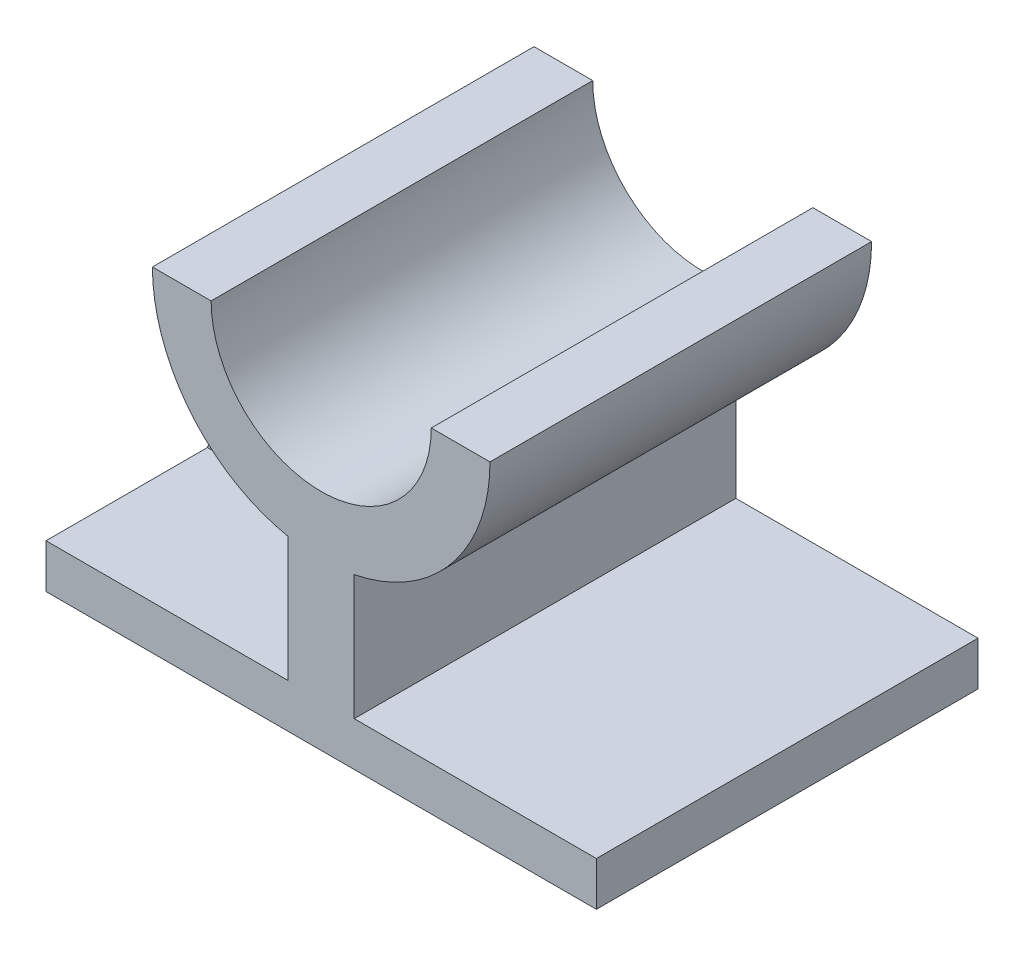
ISO-10303-21;
HEADER;
FILE_DESCRIPTION(('STEP AP214'),'2;1');
FILE_NAME('part.step','',(''),(''),'','','');
FILE_SCHEMA(('AUTOMOTIVE_DESIGN { 1 0 10303 214 1 1 1 1 }'));
ENDSEC;
DATA;
#1=APPLICATION_CONTEXT('core data for automotive mechanical design processes');
#2=APPLICATION_PROTOCOL_DEFINITION('international standard','automotive_design',2000,#1);
#3=PRODUCT_CONTEXT('',#1,'mechanical');
#4=PRODUCT('Part','Part','',(#3));
#5=PRODUCT_RELATED_PRODUCT_CATEGORY('part','',(#4));
#6=PRODUCT_DEFINITION_FORMATION('','',#4);
#7=PRODUCT_DEFINITION_CONTEXT('part definition',#1,'design');
#8=PRODUCT_DEFINITION('design','',#6,#7);
#9=PRODUCT_DEFINITION_SHAPE('','',#8);
#10=(LENGTH_UNIT() NAMED_UNIT(*) SI_UNIT(.MILLI.,.METRE.));
#11=(NAMED_UNIT(*) PLANE_ANGLE_UNIT() SI_UNIT($,.RADIAN.));
#12=(NAMED_UNIT(*) SI_UNIT($,.STERADIAN.) SOLID_ANGLE_UNIT());
#13=UNCERTAINTY_MEASURE_WITH_UNIT(LENGTH_MEASURE(1.E-05),#10,'distance_accuracy_value','');
#14=(GEOMETRIC_REPRESENTATION_CONTEXT(3) GLOBAL_UNCERTAINTY_ASSIGNED_CONTEXT((#13)) GLOBAL_UNIT_ASSIGNED_CONTEXT((#10,
#11,#12)) REPRESENTATION_CONTEXT('',''));
#15=CARTESIAN_POINT('',(0.,0.,0.));
#16=DIRECTION('',(0.,0.,1.));
#17=DIRECTION('',(1.,0.,0.));
#18=AXIS2_PLACEMENT_3D('',#15,#16,#17);
#19=CARTESIAN_POINT('',(-63.1349834925848,60.,-520.));
#20=DIRECTION('',(0.,1.,0.));
#21=DIRECTION('',(0.,0.,1.));
#22=AXIS2_PLACEMENT_3D('',#19,#20,#21);
#23=PLANE('',#22);
#24=DIRECTION('',(0.,0.,1.));
#25=VECTOR('',#24,1.);
#26=CARTESIAN_POINT('',(266.865016507415,60.,-520.));
#27=LINE('',#26,#25);
#28=CARTESIAN_POINT('',(266.865016507415,60.,-220.));
#29=VERTEX_POINT('',#28);
#30=CARTESIAN_POINT('',(266.865016507415,60.,0.));
#31=VERTEX_POINT('',#30);
#32=EDGE_CURVE('E154',#29,#31,#27,.T.);
#33=ORIENTED_EDGE('',*,*,#32,.F.);
#34=DIRECTION('',(-1.,0.,0.));
#35=VECTOR('',#34,1.);
#36=CARTESIAN_POINT('',(-63.1349834925848,60.,-220.));
#37=LINE('',#36,#35);
#38=CARTESIAN_POINT('',(-63.1349834925848,60.,-220.));
#39=VERTEX_POINT('',#38);
#40=EDGE_CURVE('E240',#29,#39,#37,.T.);
#41=ORIENTED_EDGE('',*,*,#40,.T.);
#42=DIRECTION('',(0.,0.,1.));
#43=VECTOR('',#42,1.);
#44=CARTESIAN_POINT('',(-63.1349834925848,60.,-520.));
#45=LINE('',#44,#43);
#46=CARTESIAN_POINT('',(-63.1349834925848,60.,0.));
#47=VERTEX_POINT('',#46);
#48=EDGE_CURVE('E42',#39,#47,#45,.T.);
#49=ORIENTED_EDGE('',*,*,#48,.T.);
#50=DIRECTION('',(-1.,0.,0.));
#51=VECTOR('',#50,1.);
#52=CARTESIAN_POINT('',(-63.1349834925848,60.,0.));
#53=LINE('',#52,#51);
#54=EDGE_CURVE('E210',#31,#47,#53,.T.);
#55=ORIENTED_EDGE('',*,*,#54,.F.);
#56=EDGE_LOOP('',(#33,#41,#49,#55));
#57=FACE_BOUND('',#56,.T.);
#58=ADVANCED_FACE('F33',(#57),#23,.T.);
#59=CARTESIAN_POINT('',(266.865016507415,60.,-520.));
#60=DIRECTION('',(-1.,0.,0.));
#61=DIRECTION('',(0.,0.,1.));
#62=AXIS2_PLACEMENT_3D('',#59,#60,#61);
#63=PLANE('',#62);
#64=DIRECTION('',(0.,0.,1.));
#65=VECTOR('',#64,1.);
#66=CARTESIAN_POINT('',(266.865016507415,230.,-520.));
#67=LINE('',#66,#65);
#68=CARTESIAN_POINT('',(266.865016507415,230.,-220.));
#69=VERTEX_POINT('',#68);
#70=CARTESIAN_POINT('',(266.865016507415,230.,0.));
#71=VERTEX_POINT('',#70);
#72=EDGE_CURVE('E155',#69,#71,#67,.T.);
#73=ORIENTED_EDGE('',*,*,#72,.F.);
#74=DIRECTION('',(0.,-1.,0.));
#75=VECTOR('',#74,1.);
#76=CARTESIAN_POINT('',(266.865016507415,60.,-220.));
#77=LINE('',#76,#75);
#78=EDGE_CURVE('E249',#69,#29,#77,.T.);
#79=ORIENTED_EDGE('',*,*,#78,.T.);
#80=ORIENTED_EDGE('',*,*,#32,.T.);
#81=DIRECTION('',(0.,-1.,0.));
#82=VECTOR('',#81,1.);
#83=CARTESIAN_POINT('',(266.865016507415,60.,0.));
#84=LINE('',#83,#82);
#85=EDGE_CURVE('E207',#71,#31,#84,.T.);
#86=ORIENTED_EDGE('',*,*,#85,.F.);
#87=EDGE_LOOP('',(#73,#79,#80,#86));
#88=FACE_BOUND('',#87,.T.);
#89=ADVANCED_FACE('F247',(#88),#63,.T.);
#90=CARTESIAN_POINT('',(311.865016507415,455.554871372799,-520.));
#91=DIRECTION('',(0.,0.,1.));
#92=DIRECTION('',(1.,0.,0.));
#93=AXIS2_PLACEMENT_3D('',#90,#91,#92);
#94=CYLINDRICAL_SURFACE('',#93,230.);
#95=DIRECTION('',(0.,0.,1.));
#96=VECTOR('',#95,1.);
#97=CARTESIAN_POINT('',(81.8650165074152,455.554871372799,-520.));
#98=LINE('',#97,#96);
#99=CARTESIAN_POINT('',(81.8650165074152,455.554871372799,-220.));
#100=VERTEX_POINT('',#99);
#101=CARTESIAN_POINT('',(81.8650165074152,455.554871372799,0.));
#102=VERTEX_POINT('',#101);
#103=EDGE_CURVE('E218',#100,#102,#98,.T.);
#104=ORIENTED_EDGE('',*,*,#103,.F.);
#105=CARTESIAN_POINT('',(311.865016507415,455.554871372799,-220.));
#106=DIRECTION('',(0.,0.,-1.));
#107=DIRECTION('',(-1.,0.,0.));
#108=AXIS2_PLACEMENT_3D('',#105,#106,#107);
#109=CIRCLE('',#108,230.);
#110=EDGE_CURVE('E252',#100,#69,#109,.F.);
#111=ORIENTED_EDGE('',*,*,#110,.T.);
#112=ORIENTED_EDGE('',*,*,#72,.T.);
#113=CARTESIAN_POINT('',(311.865016507415,455.554871372799,0.));
#114=DIRECTION('',(0.,0.,1.));
#115=DIRECTION('',(1.,0.,0.));
#116=AXIS2_PLACEMENT_3D('',#113,#114,#115);
#117=CIRCLE('',#116,230.);
#118=EDGE_CURVE('E204',#102,#71,#117,.T.);
#119=ORIENTED_EDGE('',*,*,#118,.F.);
#120=EDGE_LOOP('',(#104,#111,#112,#119));
#121=FACE_BOUND('',#120,.T.);
#122=ADVANCED_FACE('F315',(#121),#94,.T.);
#123=CARTESIAN_POINT('',(-63.1349834925848,0.,-520.));
#124=DIRECTION('',(-1.,0.,0.));
#125=DIRECTION('',(0.,0.,1.));
#126=AXIS2_PLACEMENT_3D('',#123,#124,#125);
#127=PLANE('',#126);
#128=DIRECTION('',(0.,0.,1.));
#129=VECTOR('',#128,1.);
#130=CARTESIAN_POINT('',(-63.1349834925848,0.,-520.));
#131=LINE('',#130,#129);
#132=CARTESIAN_POINT('',(-63.1349834925848,0.,-520.));
#133=VERTEX_POINT('',#132);
#134=CARTESIAN_POINT('',(-63.1349834925848,0.,0.));
#135=VERTEX_POINT('',#134);
#136=EDGE_CURVE('E37',#133,#135,#131,.T.);
#137=ORIENTED_EDGE('',*,*,#136,.T.);
#138=DIRECTION('',(0.,-1.,0.));
#139=VECTOR('',#138,1.);
#140=CARTESIAN_POINT('',(-63.1349834925848,0.,0.));
#141=LINE('',#140,#139);
#142=EDGE_CURVE('E176',#47,#135,#141,.T.);
#143=ORIENTED_EDGE('',*,*,#142,.F.);
#144=ORIENTED_EDGE('',*,*,#48,.F.);
#145=DIRECTION('',(0.,0.,-1.));
#146=VECTOR('',#145,1.);
#147=CARTESIAN_POINT('',(-63.1349834925848,60.,-520.));
#148=LINE('',#147,#146);
#149=CARTESIAN_POINT('',(-63.1349834925848,60.,-300.));
#150=VERTEX_POINT('',#149);
#151=EDGE_CURVE('E180',#150,#39,#148,.F.);
#152=ORIENTED_EDGE('',*,*,#151,.F.);
#153=CARTESIAN_POINT('',(-63.1349834925848,60.,-520.));
#154=VERTEX_POINT('',#153);
#155=EDGE_CURVE('E11',#154,#150,#45,.T.);
#156=ORIENTED_EDGE('',*,*,#155,.F.);
#157=DIRECTION('',(0.,-1.,0.));
#158=VECTOR('',#157,1.);
#159=CARTESIAN_POINT('',(-63.1349834925848,0.,-520.));
#160=LINE('',#159,#158);
#161=EDGE_CURVE('E212',#154,#133,#160,.T.);
#162=ORIENTED_EDGE('',*,*,#161,.T.);
#163=EDGE_LOOP('',(#137,#143,#144,#152,#156,#162));
#164=FACE_BOUND('',#163,.T.);
#165=ADVANCED_FACE('F35',(#164),#127,.T.);
#166=DIRECTION('',(-1.,0.,0.));
#167=VECTOR('',#166,1.);
#168=CARTESIAN_POINT('',(-63.1349834925848,60.,-300.));
#169=LINE('',#168,#167);
#170=CARTESIAN_POINT('',(266.865016507415,60.,-300.));
#171=VERTEX_POINT('',#170);
#172=EDGE_CURVE('E263',#171,#150,#169,.T.);
#173=ORIENTED_EDGE('',*,*,#172,.F.);
#174=CARTESIAN_POINT('',(266.865016507415,60.,-520.));
#175=VERTEX_POINT('',#174);
#176=EDGE_CURVE('E214',#175,#171,#27,.T.);
#177=ORIENTED_EDGE('',*,*,#176,.F.);
#178=DIRECTION('',(-1.,0.,0.));
#179=VECTOR('',#178,1.);
#180=CARTESIAN_POINT('',(-63.1349834925848,60.,-520.));
#181=LINE('',#180,#179);
#182=EDGE_CURVE('E164',#175,#154,#181,.T.);
#183=ORIENTED_EDGE('',*,*,#182,.T.);
#184=ORIENTED_EDGE('',*,*,#155,.T.);
#185=EDGE_LOOP('',(#173,#177,#183,#184));
#186=FACE_BOUND('',#185,.T.);
#187=ADVANCED_FACE('F328',(#186),#23,.T.);
#188=DIRECTION('',(0.,-1.,0.));
#189=VECTOR('',#188,1.);
#190=CARTESIAN_POINT('',(266.865016507415,60.,-300.));
#191=LINE('',#190,#189);
#192=CARTESIAN_POINT('',(266.865016507415,230.,-300.));
#193=VERTEX_POINT('',#192);
#194=EDGE_CURVE('E150',#193,#171,#191,.T.);
#195=ORIENTED_EDGE('',*,*,#194,.F.);
#196=CARTESIAN_POINT('',(266.865016507415,230.,-520.));
#197=VERTEX_POINT('',#196);
#198=EDGE_CURVE('E142',#197,#193,#67,.T.);
#199=ORIENTED_EDGE('',*,*,#198,.F.);
#200=DIRECTION('',(0.,-1.,0.));
#201=VECTOR('',#200,1.);
#202=CARTESIAN_POINT('',(266.865016507415,60.,-520.));
#203=LINE('',#202,#201);
#204=EDGE_CURVE('E146',#197,#175,#203,.T.);
#205=ORIENTED_EDGE('',*,*,#204,.T.);
#206=ORIENTED_EDGE('',*,*,#176,.T.);
#207=EDGE_LOOP('',(#195,#199,#205,#206));
#208=FACE_BOUND('',#207,.T.);
#209=ADVANCED_FACE('F144',(#208),#63,.T.);
#210=CARTESIAN_POINT('',(311.865016507415,455.554871372799,-300.));
#211=DIRECTION('',(0.,0.,-1.));
#212=DIRECTION('',(-1.,0.,0.));
#213=AXIS2_PLACEMENT_3D('',#210,#211,#212);
#214=CIRCLE('',#213,230.);
#215=CARTESIAN_POINT('',(81.8650165074152,455.554871372799,-300.));
#216=VERTEX_POINT('',#215);
#217=EDGE_CURVE('E254',#216,#193,#214,.F.);
#218=ORIENTED_EDGE('',*,*,#217,.F.);
#219=CARTESIAN_POINT('',(81.8650165074152,455.554871372799,-520.));
#220=VERTEX_POINT('',#219);
#221=EDGE_CURVE('E168',#220,#216,#98,.T.);
#222=ORIENTED_EDGE('',*,*,#221,.F.);
#223=CARTESIAN_POINT('',(311.865016507415,455.554871372799,-520.));
#224=DIRECTION('',(0.,0.,1.));
#225=DIRECTION('',(1.,0.,0.));
#226=AXIS2_PLACEMENT_3D('',#223,#224,#225);
#227=CIRCLE('',#226,230.);
#228=EDGE_CURVE('E161',#220,#197,#227,.T.);
#229=ORIENTED_EDGE('',*,*,#228,.T.);
#230=ORIENTED_EDGE('',*,*,#198,.T.);
#231=EDGE_LOOP('',(#218,#222,#229,#230));
#232=FACE_BOUND('',#231,.T.);
#233=ADVANCED_FACE('F166',(#232),#94,.T.);
#234=CARTESIAN_POINT('',(81.8650165074152,455.554871372799,-520.));
#235=DIRECTION('',(0.,1.,0.));
#236=DIRECTION('',(0.,0.,1.));
#237=AXIS2_PLACEMENT_3D('',#234,#235,#236);
#238=PLANE('',#237);
#239=ORIENTED_EDGE('',*,*,#221,.T.);
#240=EDGE_CURVE('E217',#216,#100,#98,.T.);
#241=ORIENTED_EDGE('',*,*,#240,.T.);
#242=ORIENTED_EDGE('',*,*,#103,.T.);
#243=DIRECTION('',(-1.,0.,0.));
#244=VECTOR('',#243,1.);
#245=CARTESIAN_POINT('',(81.8650165074152,455.554871372799,0.));
#246=LINE('',#245,#244);
#247=CARTESIAN_POINT('',(161.865016507415,455.554871372799,0.));
#248=VERTEX_POINT('',#247);
#249=EDGE_CURVE('E201',#248,#102,#246,.T.);
#250=ORIENTED_EDGE('',*,*,#249,.F.);
#251=DIRECTION('',(0.,0.,1.));
#252=VECTOR('',#251,1.);
#253=CARTESIAN_POINT('',(161.865016507415,455.554871372799,-520.));
#254=LINE('',#253,#252);
#255=CARTESIAN_POINT('',(161.865016507415,455.554871372799,-520.));
#256=VERTEX_POINT('',#255);
#257=EDGE_CURVE('E219',#256,#248,#254,.T.);
#258=ORIENTED_EDGE('',*,*,#257,.F.);
#259=DIRECTION('',(-1.,0.,0.));
#260=VECTOR('',#259,1.);
#261=CARTESIAN_POINT('',(81.8650165074152,455.554871372799,-520.));
#262=LINE('',#261,#260);
#263=EDGE_CURVE('E169',#256,#220,#262,.T.);
#264=ORIENTED_EDGE('',*,*,#263,.T.);
#265=EDGE_LOOP('',(#239,#241,#242,#250,#258,#264));
#266=FACE_BOUND('',#265,.T.);
#267=ADVANCED_FACE('F311',(#266),#238,.T.);
#268=CARTESIAN_POINT('',(311.865016507415,455.554871372799,-520.));
#269=DIRECTION('',(0.,0.,1.));
#270=DIRECTION('',(1.,0.,0.));
#271=AXIS2_PLACEMENT_3D('',#268,#269,#270);
#272=CYLINDRICAL_SURFACE('',#271,150.);
#273=ORIENTED_EDGE('',*,*,#257,.T.);
#274=CARTESIAN_POINT('',(311.865016507415,455.554871372799,0.));
#275=DIRECTION('',(0.,0.,-1.));
#276=DIRECTION('',(1.,0.,0.));
#277=AXIS2_PLACEMENT_3D('',#274,#275,#276);
#278=CIRCLE('',#277,150.);
#279=CARTESIAN_POINT('',(461.865016507415,455.554871372799,0.));
#280=VERTEX_POINT('',#279);
#281=EDGE_CURVE('E198',#280,#248,#278,.T.);
#282=ORIENTED_EDGE('',*,*,#281,.F.);
#283=DIRECTION('',(0.,0.,1.));
#284=VECTOR('',#283,1.);
#285=CARTESIAN_POINT('',(461.865016507415,455.554871372799,-520.));
#286=LINE('',#285,#284);
#287=CARTESIAN_POINT('',(461.865016507415,455.554871372799,-520.));
#288=VERTEX_POINT('',#287);
#289=EDGE_CURVE('E221',#288,#280,#286,.T.);
#290=ORIENTED_EDGE('',*,*,#289,.F.);
#291=CARTESIAN_POINT('',(311.865016507415,455.554871372799,-520.));
#292=DIRECTION('',(0.,0.,-1.));
#293=DIRECTION('',(1.,0.,0.));
#294=AXIS2_PLACEMENT_3D('',#291,#292,#293);
#295=CIRCLE('',#294,150.);
#296=EDGE_CURVE('E171',#288,#256,#295,.T.);
#297=ORIENTED_EDGE('',*,*,#296,.T.);
#298=EDGE_LOOP('',(#273,#282,#290,#297));
#299=FACE_BOUND('',#298,.T.);
#300=ADVANCED_FACE('F287',(#299),#272,.F.);
#301=CARTESIAN_POINT('',(461.865016507415,455.554871372799,-520.));
#302=DIRECTION('',(0.,1.,0.));
#303=DIRECTION('',(0.,0.,1.));
#304=AXIS2_PLACEMENT_3D('',#301,#302,#303);
#305=PLANE('',#304);
#306=ORIENTED_EDGE('',*,*,#289,.T.);
#307=DIRECTION('',(-1.,0.,0.));
#308=VECTOR('',#307,1.);
#309=CARTESIAN_POINT('',(461.865016507415,455.554871372799,0.));
#310=LINE('',#309,#308);
#311=CARTESIAN_POINT('',(541.865016507415,455.554871372799,0.));
#312=VERTEX_POINT('',#311);
#313=EDGE_CURVE('E195',#312,#280,#310,.T.);
#314=ORIENTED_EDGE('',*,*,#313,.F.);
#315=DIRECTION('',(0.,0.,1.));
#316=VECTOR('',#315,1.);
#317=CARTESIAN_POINT('',(541.865016507415,455.554871372799,-520.));
#318=LINE('',#317,#316);
#319=CARTESIAN_POINT('',(541.865016507415,455.554871372799,-520.));
#320=VERTEX_POINT('',#319);
#321=EDGE_CURVE('E223',#320,#312,#318,.T.);
#322=ORIENTED_EDGE('',*,*,#321,.F.);
#323=DIRECTION('',(-1.,0.,0.));
#324=VECTOR('',#323,1.);
#325=CARTESIAN_POINT('',(461.865016507415,455.554871372799,-520.));
#326=LINE('',#325,#324);
#327=EDGE_CURVE('E282',#320,#288,#326,.T.);
#328=ORIENTED_EDGE('',*,*,#327,.T.);
#329=EDGE_LOOP('',(#306,#314,#322,#328));
#330=FACE_BOUND('',#329,.T.);
#331=ADVANCED_FACE('F293',(#330),#305,.T.);
#332=CARTESIAN_POINT('',(311.865016507415,455.554871372799,-520.));
#333=DIRECTION('',(0.,0.,1.));
#334=DIRECTION('',(1.,0.,0.));
#335=AXIS2_PLACEMENT_3D('',#332,#333,#334);
#336=CYLINDRICAL_SURFACE('',#335,230.);
#337=ORIENTED_EDGE('',*,*,#321,.T.);
#338=CARTESIAN_POINT('',(311.865016507415,455.554871372799,0.));
#339=DIRECTION('',(0.,0.,1.));
#340=DIRECTION('',(1.,0.,0.));
#341=AXIS2_PLACEMENT_3D('',#338,#339,#340);
#342=CIRCLE('',#341,230.);
#343=CARTESIAN_POINT('',(356.865016507415,230.,0.));
#344=VERTEX_POINT('',#343);
#345=EDGE_CURVE('E192',#344,#312,#342,.T.);
#346=ORIENTED_EDGE('',*,*,#345,.F.);
#347=DIRECTION('',(0.,0.,1.));
#348=VECTOR('',#347,1.);
#349=CARTESIAN_POINT('',(356.865016507415,230.,-520.));
#350=LINE('',#349,#348);
#351=CARTESIAN_POINT('',(356.865016507415,230.,-520.));
#352=VERTEX_POINT('',#351);
#353=EDGE_CURVE('E225',#352,#344,#350,.T.);
#354=ORIENTED_EDGE('',*,*,#353,.F.);
#355=CARTESIAN_POINT('',(311.865016507415,455.554871372799,-520.));
#356=DIRECTION('',(0.,0.,1.));
#357=DIRECTION('',(1.,0.,0.));
#358=AXIS2_PLACEMENT_3D('',#355,#356,#357);
#359=CIRCLE('',#358,230.);
#360=EDGE_CURVE('E279',#352,#320,#359,.T.);
#361=ORIENTED_EDGE('',*,*,#360,.T.);
#362=EDGE_LOOP('',(#337,#346,#354,#361));
#363=FACE_BOUND('',#362,.T.);
#364=ADVANCED_FACE('F297',(#363),#336,.T.);
#365=CARTESIAN_POINT('',(356.865016507415,60.,-520.));
#366=DIRECTION('',(1.,0.,0.));
#367=DIRECTION('',(0.,0.,-1.));
#368=AXIS2_PLACEMENT_3D('',#365,#366,#367);
#369=PLANE('',#368);
#370=ORIENTED_EDGE('',*,*,#353,.T.);
#371=DIRECTION('',(0.,1.,0.));
#372=VECTOR('',#371,1.);
#373=CARTESIAN_POINT('',(356.865016507415,60.,0.));
#374=LINE('',#373,#372);
#375=CARTESIAN_POINT('',(356.865016507415,60.,0.));
#376=VERTEX_POINT('',#375);
#377=EDGE_CURVE('E189',#376,#344,#374,.T.);
#378=ORIENTED_EDGE('',*,*,#377,.F.);
#379=DIRECTION('',(0.,0.,1.));
#380=VECTOR('',#379,1.);
#381=CARTESIAN_POINT('',(356.865016507415,60.,-520.));
#382=LINE('',#381,#380);
#383=CARTESIAN_POINT('',(356.865016507415,60.,-520.));
#384=VERTEX_POINT('',#383);
#385=EDGE_CURVE('E227',#384,#376,#382,.T.);
#386=ORIENTED_EDGE('',*,*,#385,.F.);
#387=DIRECTION('',(0.,1.,0.));
#388=VECTOR('',#387,1.);
#389=CARTESIAN_POINT('',(356.865016507415,60.,-520.));
#390=LINE('',#389,#388);
#391=EDGE_CURVE('E276',#384,#352,#390,.T.);
#392=ORIENTED_EDGE('',*,*,#391,.T.);
#393=EDGE_LOOP('',(#370,#378,#386,#392));
#394=FACE_BOUND('',#393,.T.);
#395=ADVANCED_FACE('F301',(#394),#369,.T.);
#396=CARTESIAN_POINT('',(686.865016507415,60.,-520.));
#397=DIRECTION('',(0.,1.,0.));
#398=DIRECTION('',(0.,0.,1.));
#399=AXIS2_PLACEMENT_3D('',#396,#397,#398);
#400=PLANE('',#399);
#401=ORIENTED_EDGE('',*,*,#385,.T.);
#402=DIRECTION('',(-1.,0.,0.));
#403=VECTOR('',#402,1.);
#404=CARTESIAN_POINT('',(686.865016507415,60.,0.));
#405=LINE('',#404,#403);
#406=CARTESIAN_POINT('',(686.865016507415,60.,0.));
#407=VERTEX_POINT('',#406);
#408=EDGE_CURVE('E186',#407,#376,#405,.T.);
#409=ORIENTED_EDGE('',*,*,#408,.F.);
#410=DIRECTION('',(0.,0.,1.));
#411=VECTOR('',#410,1.);
#412=CARTESIAN_POINT('',(686.865016507415,60.,-520.));
#413=LINE('',#412,#411);
#414=CARTESIAN_POINT('',(686.865016507415,60.,-520.));
#415=VERTEX_POINT('',#414);
#416=EDGE_CURVE('E229',#415,#407,#413,.T.);
#417=ORIENTED_EDGE('',*,*,#416,.F.);
#418=DIRECTION('',(-1.,0.,0.));
#419=VECTOR('',#418,1.);
#420=CARTESIAN_POINT('',(686.865016507415,60.,-520.));
#421=LINE('',#420,#419);
#422=EDGE_CURVE('E273',#415,#384,#421,.T.);
#423=ORIENTED_EDGE('',*,*,#422,.T.);
#424=EDGE_LOOP('',(#401,#409,#417,#423));
#425=FACE_BOUND('',#424,.T.);
#426=ADVANCED_FACE('F305',(#425),#400,.T.);
#427=CARTESIAN_POINT('',(686.865016507415,0.,-520.));
#428=DIRECTION('',(1.,0.,0.));
#429=DIRECTION('',(0.,0.,-1.));
#430=AXIS2_PLACEMENT_3D('',#427,#428,#429);
#431=PLANE('',#430);
#432=ORIENTED_EDGE('',*,*,#416,.T.);
#433=DIRECTION('',(0.,1.,0.));
#434=VECTOR('',#433,1.);
#435=CARTESIAN_POINT('',(686.865016507415,0.,0.));
#436=LINE('',#435,#434);
#437=CARTESIAN_POINT('',(686.865016507415,0.,0.));
#438=VERTEX_POINT('',#437);
#439=EDGE_CURVE('E183',#438,#407,#436,.T.);
#440=ORIENTED_EDGE('',*,*,#439,.F.);
#441=DIRECTION('',(0.,0.,1.));
#442=VECTOR('',#441,1.);
#443=CARTESIAN_POINT('',(686.865016507415,0.,-520.));
#444=LINE('',#443,#442);
#445=CARTESIAN_POINT('',(686.865016507415,0.,-520.));
#446=VERTEX_POINT('',#445);
#447=EDGE_CURVE('E230',#446,#438,#444,.T.);
#448=ORIENTED_EDGE('',*,*,#447,.F.);
#449=DIRECTION('',(0.,1.,0.));
#450=VECTOR('',#449,1.);
#451=CARTESIAN_POINT('',(686.865016507415,0.,-520.));
#452=LINE('',#451,#450);
#453=EDGE_CURVE('E270',#446,#415,#452,.T.);
#454=ORIENTED_EDGE('',*,*,#453,.T.);
#455=EDGE_LOOP('',(#432,#440,#448,#454));
#456=FACE_BOUND('',#455,.T.);
#457=ADVANCED_FACE('F308',(#456),#431,.T.);
#458=CARTESIAN_POINT('',(-63.1349834925848,0.,-520.));
#459=DIRECTION('',(0.,-1.,0.));
#460=DIRECTION('',(0.,0.,-1.));
#461=AXIS2_PLACEMENT_3D('',#458,#459,#460);
#462=PLANE('',#461);
#463=ORIENTED_EDGE('',*,*,#447,.T.);
#464=DIRECTION('',(1.,0.,0.));
#465=VECTOR('',#464,1.);
#466=CARTESIAN_POINT('',(-63.1349834925848,0.,0.));
#467=LINE('',#466,#465);
#468=EDGE_CURVE('E179',#135,#438,#467,.T.);
#469=ORIENTED_EDGE('',*,*,#468,.F.);
#470=ORIENTED_EDGE('',*,*,#136,.F.);
#471=DIRECTION('',(1.,0.,0.));
#472=VECTOR('',#471,1.);
#473=CARTESIAN_POINT('',(-63.1349834925848,0.,-520.));
#474=LINE('',#473,#472);
#475=EDGE_CURVE('E268',#133,#446,#474,.T.);
#476=ORIENTED_EDGE('',*,*,#475,.T.);
#477=EDGE_LOOP('',(#463,#469,#470,#476));
#478=FACE_BOUND('',#477,.T.);
#479=ADVANCED_FACE('F232',(#478),#462,.T.);
#480=CARTESIAN_POINT('',(311.865016507415,455.554871372799,-520.));
#481=DIRECTION('',(0.,0.,1.));
#482=DIRECTION('',(1.,0.,0.));
#483=AXIS2_PLACEMENT_3D('',#480,#481,#482);
#484=PLANE('',#483);
#485=ORIENTED_EDGE('',*,*,#161,.F.);
#486=ORIENTED_EDGE('',*,*,#182,.F.);
#487=ORIENTED_EDGE('',*,*,#204,.F.);
#488=ORIENTED_EDGE('',*,*,#228,.F.);
#489=ORIENTED_EDGE('',*,*,#263,.F.);
#490=ORIENTED_EDGE('',*,*,#296,.F.);
#491=ORIENTED_EDGE('',*,*,#327,.F.);
#492=ORIENTED_EDGE('',*,*,#360,.F.);
#493=ORIENTED_EDGE('',*,*,#391,.F.);
#494=ORIENTED_EDGE('',*,*,#422,.F.);
#495=ORIENTED_EDGE('',*,*,#453,.F.);
#496=ORIENTED_EDGE('',*,*,#475,.F.);
#497=EDGE_LOOP('',(#485,#486,#487,#488,#489,#490,#491,#492,#493,#494,#495,#496));
#498=FACE_BOUND('',#497,.T.);
#499=ADVANCED_FACE('F159',(#498),#484,.F.);
#500=CARTESIAN_POINT('',(311.865016507415,455.554871372799,0.));
#501=DIRECTION('',(0.,0.,1.));
#502=DIRECTION('',(1.,0.,0.));
#503=AXIS2_PLACEMENT_3D('',#500,#501,#502);
#504=PLANE('',#503);
#505=ORIENTED_EDGE('',*,*,#142,.T.);
#506=ORIENTED_EDGE('',*,*,#468,.T.);
#507=ORIENTED_EDGE('',*,*,#439,.T.);
#508=ORIENTED_EDGE('',*,*,#408,.T.);
#509=ORIENTED_EDGE('',*,*,#377,.T.);
#510=ORIENTED_EDGE('',*,*,#345,.T.);
#511=ORIENTED_EDGE('',*,*,#313,.T.);
#512=ORIENTED_EDGE('',*,*,#281,.T.);
#513=ORIENTED_EDGE('',*,*,#249,.T.);
#514=ORIENTED_EDGE('',*,*,#118,.T.);
#515=ORIENTED_EDGE('',*,*,#85,.T.);
#516=ORIENTED_EDGE('',*,*,#54,.T.);
#517=EDGE_LOOP('',(#505,#506,#507,#508,#509,#510,#511,#512,#513,#514,#515,#516));
#518=FACE_BOUND('',#517,.T.);
#519=ADVANCED_FACE('F234',(#518),#504,.T.);
#520=CARTESIAN_POINT('',(81.8650165074152,455.554871372799,-260.));
#521=DIRECTION('',(0.938904534711074,-0.344177678966812,0.));
#522=DIRECTION('',(-0.344177678966812,-0.938904534711074,0.));
#523=AXIS2_PLACEMENT_3D('',#520,#521,#522);
#524=PLANE('',#523);
#525=DIRECTION('',(-0.344177678966812,-0.938904534711074,0.));
#526=VECTOR('',#525,1.);
#527=CARTESIAN_POINT('',(81.8650165074152,455.554871372799,-300.));
#528=LINE('',#527,#526);
#529=EDGE_CURVE('E256',#216,#150,#528,.T.);
#530=ORIENTED_EDGE('',*,*,#529,.T.);
#531=ORIENTED_EDGE('',*,*,#151,.T.);
#532=DIRECTION('',(-0.344177678966812,-0.938904534711074,0.));
#533=VECTOR('',#532,1.);
#534=CARTESIAN_POINT('',(81.8650165074152,455.554871372799,-220.));
#535=LINE('',#534,#533);
#536=EDGE_CURVE('E50',#100,#39,#535,.T.);
#537=ORIENTED_EDGE('',*,*,#536,.F.);
#538=ORIENTED_EDGE('',*,*,#240,.F.);
#539=EDGE_LOOP('',(#530,#531,#537,#538));
#540=FACE_BOUND('',#539,.T.);
#541=ADVANCED_FACE('F323',(#540),#524,.F.);
#542=CARTESIAN_POINT('',(311.865016507415,227.7774356864,-300.));
#543=DIRECTION('',(0.,0.,-1.));
#544=DIRECTION('',(-1.,0.,0.));
#545=AXIS2_PLACEMENT_3D('',#542,#543,#544);
#546=PLANE('',#545);
#547=ORIENTED_EDGE('',*,*,#194,.T.);
#548=ORIENTED_EDGE('',*,*,#172,.T.);
#549=ORIENTED_EDGE('',*,*,#529,.F.);
#550=ORIENTED_EDGE('',*,*,#217,.T.);
#551=EDGE_LOOP('',(#547,#548,#549,#550));
#552=FACE_BOUND('',#551,.T.);
#553=ADVANCED_FACE('F330',(#552),#546,.T.);
#554=CARTESIAN_POINT('',(311.865016507415,227.7774356864,-220.));
#555=DIRECTION('',(0.,0.,-1.));
#556=DIRECTION('',(-1.,0.,0.));
#557=AXIS2_PLACEMENT_3D('',#554,#555,#556);
#558=PLANE('',#557);
#559=ORIENTED_EDGE('',*,*,#40,.F.);
#560=ORIENTED_EDGE('',*,*,#78,.F.);
#561=ORIENTED_EDGE('',*,*,#110,.F.);
#562=ORIENTED_EDGE('',*,*,#536,.T.);
#563=EDGE_LOOP('',(#559,#560,#561,#562));
#564=FACE_BOUND('',#563,.T.);
#565=ADVANCED_FACE('F317',(#564),#558,.F.);
#566=CLOSED_SHELL('',(#58,#89,#122,#165,#187,#209,#233,#267,#300,#331,#364,#395,#426,#457,#479,
#499,#519,#541,#553,#565));
#567=MANIFOLD_SOLID_BREP('B2',#566);
#568=ADVANCED_BREP_SHAPE_REPRESENTATION('',(#18,#567),#14);
#569=SHAPE_DEFINITION_REPRESENTATION(#9,#568);
ENDSEC;
END-ISO-10303-21;
